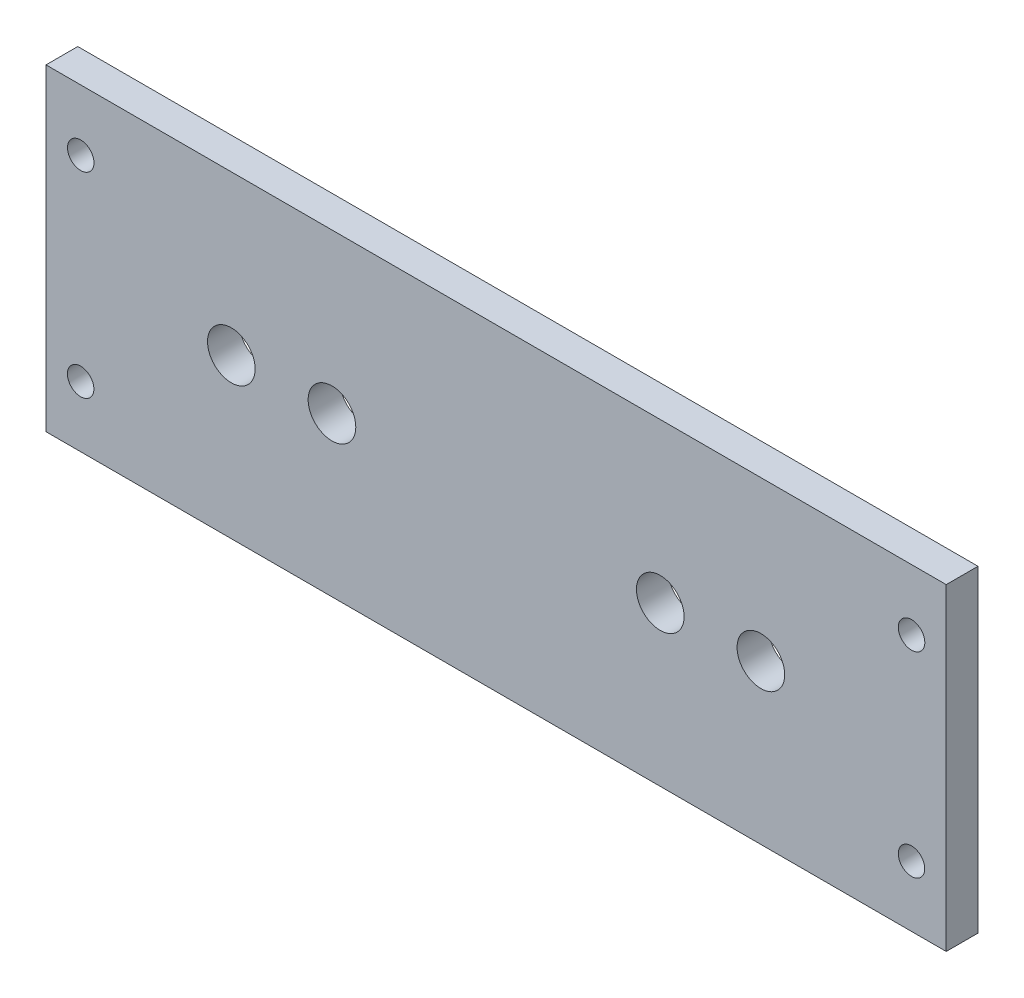
ISO-10303-21;
HEADER;
FILE_DESCRIPTION(('STEP AP214'),'2;1');
FILE_NAME('part.step','',(''),(''),'','','');
FILE_SCHEMA(('AUTOMOTIVE_DESIGN { 1 0 10303 214 1 1 1 1 }'));
ENDSEC;
DATA;
#1=APPLICATION_CONTEXT('core data for automotive mechanical design processes');
#2=APPLICATION_PROTOCOL_DEFINITION('international standard','automotive_design',2000,#1);
#3=PRODUCT_CONTEXT('',#1,'mechanical');
#4=PRODUCT('Part','Part','',(#3));
#5=PRODUCT_RELATED_PRODUCT_CATEGORY('part','',(#4));
#6=PRODUCT_DEFINITION_FORMATION('','',#4);
#7=PRODUCT_DEFINITION_CONTEXT('part definition',#1,'design');
#8=PRODUCT_DEFINITION('design','',#6,#7);
#9=PRODUCT_DEFINITION_SHAPE('','',#8);
#10=(LENGTH_UNIT() NAMED_UNIT(*) SI_UNIT(.MILLI.,.METRE.));
#11=(NAMED_UNIT(*) PLANE_ANGLE_UNIT() SI_UNIT($,.RADIAN.));
#12=(NAMED_UNIT(*) SI_UNIT($,.STERADIAN.) SOLID_ANGLE_UNIT());
#13=UNCERTAINTY_MEASURE_WITH_UNIT(LENGTH_MEASURE(1.E-05),#10,'distance_accuracy_value','');
#14=(GEOMETRIC_REPRESENTATION_CONTEXT(3) GLOBAL_UNCERTAINTY_ASSIGNED_CONTEXT((#13)) GLOBAL_UNIT_ASSIGNED_CONTEXT((#10,
#11,#12)) REPRESENTATION_CONTEXT('',''));
#15=CARTESIAN_POINT('',(0.,0.,0.));
#16=DIRECTION('',(0.,0.,1.));
#17=DIRECTION('',(1.,0.,0.));
#18=AXIS2_PLACEMENT_3D('',#15,#16,#17);
#19=CARTESIAN_POINT('',(84.,-25.,6.));
#20=DIRECTION('',(0.,-1.,0.));
#21=DIRECTION('',(0.,0.,-1.));
#22=AXIS2_PLACEMENT_3D('',#19,#20,#21);
#23=PLANE('',#22);
#24=DIRECTION('',(-1.,0.,0.));
#25=VECTOR('',#24,1.);
#26=CARTESIAN_POINT('',(84.,-25.,0.));
#27=LINE('',#26,#25);
#28=CARTESIAN_POINT('',(84.,-25.,0.));
#29=VERTEX_POINT('',#28);
#30=CARTESIAN_POINT('',(-86.,-25.,0.));
#31=VERTEX_POINT('',#30);
#32=EDGE_CURVE('E102',#29,#31,#27,.T.);
#33=ORIENTED_EDGE('',*,*,#32,.F.);
#34=DIRECTION('',(0.,0.,-1.));
#35=VECTOR('',#34,1.);
#36=CARTESIAN_POINT('',(84.,-25.,6.));
#37=LINE('',#36,#35);
#38=CARTESIAN_POINT('',(84.,-25.,6.));
#39=VERTEX_POINT('',#38);
#40=EDGE_CURVE('E11',#39,#29,#37,.T.);
#41=ORIENTED_EDGE('',*,*,#40,.F.);
#42=DIRECTION('',(-1.,0.,0.));
#43=VECTOR('',#42,1.);
#44=CARTESIAN_POINT('',(84.,-25.,6.));
#45=LINE('',#44,#43);
#46=CARTESIAN_POINT('',(-86.,-25.,6.));
#47=VERTEX_POINT('',#46);
#48=EDGE_CURVE('E95',#39,#47,#45,.T.);
#49=ORIENTED_EDGE('',*,*,#48,.T.);
#50=DIRECTION('',(0.,0.,-1.));
#51=VECTOR('',#50,1.);
#52=CARTESIAN_POINT('',(-86.,-25.,6.));
#53=LINE('',#52,#51);
#54=EDGE_CURVE('E40',#47,#31,#53,.T.);
#55=ORIENTED_EDGE('',*,*,#54,.T.);
#56=EDGE_LOOP('',(#33,#41,#49,#55));
#57=FACE_BOUND('',#56,.T.);
#58=ADVANCED_FACE('F37',(#57),#23,.T.);
#59=CARTESIAN_POINT('',(84.,35.,6.));
#60=DIRECTION('',(1.,0.,0.));
#61=DIRECTION('',(0.,0.,-1.));
#62=AXIS2_PLACEMENT_3D('',#59,#60,#61);
#63=PLANE('',#62);
#64=DIRECTION('',(0.,-1.,0.));
#65=VECTOR('',#64,1.);
#66=CARTESIAN_POINT('',(84.,35.,0.));
#67=LINE('',#66,#65);
#68=CARTESIAN_POINT('',(84.,35.,0.));
#69=VERTEX_POINT('',#68);
#70=EDGE_CURVE('E97',#69,#29,#67,.T.);
#71=ORIENTED_EDGE('',*,*,#70,.F.);
#72=DIRECTION('',(0.,0.,-1.));
#73=VECTOR('',#72,1.);
#74=CARTESIAN_POINT('',(84.,35.,6.));
#75=LINE('',#74,#73);
#76=CARTESIAN_POINT('',(84.,35.,6.));
#77=VERTEX_POINT('',#76);
#78=EDGE_CURVE('E46',#77,#69,#75,.T.);
#79=ORIENTED_EDGE('',*,*,#78,.F.);
#80=DIRECTION('',(0.,-1.,0.));
#81=VECTOR('',#80,1.);
#82=CARTESIAN_POINT('',(84.,35.,6.));
#83=LINE('',#82,#81);
#84=EDGE_CURVE('E92',#77,#39,#83,.T.);
#85=ORIENTED_EDGE('',*,*,#84,.T.);
#86=ORIENTED_EDGE('',*,*,#40,.T.);
#87=EDGE_LOOP('',(#71,#79,#85,#86));
#88=FACE_BOUND('',#87,.T.);
#89=ADVANCED_FACE('F113',(#88),#63,.T.);
#90=CARTESIAN_POINT('',(-86.,35.,6.));
#91=DIRECTION('',(0.,1.,0.));
#92=DIRECTION('',(-1.,0.,0.));
#93=AXIS2_PLACEMENT_3D('',#90,#91,#92);
#94=PLANE('',#93);
#95=DIRECTION('',(1.,0.,0.));
#96=VECTOR('',#95,1.);
#97=CARTESIAN_POINT('',(-86.,35.,0.));
#98=LINE('',#97,#96);
#99=CARTESIAN_POINT('',(-86.,35.,0.));
#100=VERTEX_POINT('',#99);
#101=EDGE_CURVE('E87',#100,#69,#98,.T.);
#102=ORIENTED_EDGE('',*,*,#101,.F.);
#103=DIRECTION('',(0.,0.,-1.));
#104=VECTOR('',#103,1.);
#105=CARTESIAN_POINT('',(-86.,35.,6.));
#106=LINE('',#105,#104);
#107=CARTESIAN_POINT('',(-86.,35.,6.));
#108=VERTEX_POINT('',#107);
#109=EDGE_CURVE('E82',#108,#100,#106,.T.);
#110=ORIENTED_EDGE('',*,*,#109,.F.);
#111=DIRECTION('',(1.,0.,0.));
#112=VECTOR('',#111,1.);
#113=CARTESIAN_POINT('',(-86.,35.,6.));
#114=LINE('',#113,#112);
#115=EDGE_CURVE('E85',#108,#77,#114,.T.);
#116=ORIENTED_EDGE('',*,*,#115,.T.);
#117=ORIENTED_EDGE('',*,*,#78,.T.);
#118=EDGE_LOOP('',(#102,#110,#116,#117));
#119=FACE_BOUND('',#118,.T.);
#120=ADVANCED_FACE('F84',(#119),#94,.T.);
#121=CARTESIAN_POINT('',(-86.,-25.,6.));
#122=DIRECTION('',(-1.,0.,0.));
#123=DIRECTION('',(0.,0.,1.));
#124=AXIS2_PLACEMENT_3D('',#121,#122,#123);
#125=PLANE('',#124);
#126=DIRECTION('',(0.,1.,0.));
#127=VECTOR('',#126,1.);
#128=CARTESIAN_POINT('',(-86.,-25.,0.));
#129=LINE('',#128,#127);
#130=EDGE_CURVE('E105',#31,#100,#129,.T.);
#131=ORIENTED_EDGE('',*,*,#130,.F.);
#132=ORIENTED_EDGE('',*,*,#54,.F.);
#133=DIRECTION('',(0.,1.,0.));
#134=VECTOR('',#133,1.);
#135=CARTESIAN_POINT('',(-86.,-25.,6.));
#136=LINE('',#135,#134);
#137=EDGE_CURVE('E91',#47,#108,#136,.T.);
#138=ORIENTED_EDGE('',*,*,#137,.T.);
#139=ORIENTED_EDGE('',*,*,#109,.T.);
#140=EDGE_LOOP('',(#131,#132,#138,#139));
#141=FACE_BOUND('',#140,.T.);
#142=ADVANCED_FACE('F94',(#141),#125,.T.);
#143=CARTESIAN_POINT('',(0.,0.,6.));
#144=DIRECTION('',(0.,0.,-1.));
#145=DIRECTION('',(-1.,0.,0.));
#146=AXIS2_PLACEMENT_3D('',#143,#144,#145);
#147=PLANE('',#146);
#148=CARTESIAN_POINT('',(77.455,23.4999999999992,6.));
#149=DIRECTION('',(0.,0.,-1.));
#150=DIRECTION('',(-1.,0.,0.));
#151=AXIS2_PLACEMENT_3D('',#148,#149,#150);
#152=CIRCLE('',#151,2.49999999999999);
#153=CARTESIAN_POINT('',(74.955,23.4999999999992,6.));
#154=VERTEX_POINT('',#153);
#155=EDGE_CURVE('E170',#154,#154,#152,.T.);
#156=ORIENTED_EDGE('',*,*,#155,.T.);
#157=EDGE_LOOP('',(#156));
#158=FACE_BOUND('',#157,.T.);
#159=CARTESIAN_POINT('',(77.4449999999996,-13.5000000000008,6.));
#160=DIRECTION('',(0.,0.,-1.));
#161=DIRECTION('',(-1.,0.,0.));
#162=AXIS2_PLACEMENT_3D('',#159,#160,#161);
#163=CIRCLE('',#162,2.49999999999999);
#164=CARTESIAN_POINT('',(74.9449999999996,-13.5000000000008,6.));
#165=VERTEX_POINT('',#164);
#166=EDGE_CURVE('E178',#165,#165,#163,.T.);
#167=ORIENTED_EDGE('',*,*,#166,.T.);
#168=EDGE_LOOP('',(#167));
#169=FACE_BOUND('',#168,.T.);
#170=CARTESIAN_POINT('',(-79.4550000000005,-13.5000000000008,6.));
#171=DIRECTION('',(0.,0.,-1.));
#172=DIRECTION('',(-1.,0.,0.));
#173=AXIS2_PLACEMENT_3D('',#170,#171,#172);
#174=CIRCLE('',#173,2.49999999999999);
#175=CARTESIAN_POINT('',(-81.9550000000005,-13.5000000000008,6.));
#176=VERTEX_POINT('',#175);
#177=EDGE_CURVE('E184',#176,#176,#174,.T.);
#178=ORIENTED_EDGE('',*,*,#177,.T.);
#179=EDGE_LOOP('',(#178));
#180=FACE_BOUND('',#179,.T.);
#181=CARTESIAN_POINT('',(-79.4450000000001,23.4999999999992,6.));
#182=DIRECTION('',(0.,0.,-1.));
#183=DIRECTION('',(-1.,0.,0.));
#184=AXIS2_PLACEMENT_3D('',#181,#182,#183);
#185=CIRCLE('',#184,2.5);
#186=CARTESIAN_POINT('',(-81.9450000000001,23.4999999999992,6.));
#187=VERTEX_POINT('',#186);
#188=EDGE_CURVE('E190',#187,#187,#185,.T.);
#189=ORIENTED_EDGE('',*,*,#188,.T.);
#190=EDGE_LOOP('',(#189));
#191=FACE_BOUND('',#190,.T.);
#192=CARTESIAN_POINT('',(-51.,4.99999999999999,6.));
#193=DIRECTION('',(0.,0.,-1.));
#194=DIRECTION('',(1.,0.,0.));
#195=AXIS2_PLACEMENT_3D('',#192,#193,#194);
#196=CIRCLE('',#195,4.5);
#197=CARTESIAN_POINT('',(-46.5,4.99999999999999,6.));
#198=VERTEX_POINT('',#197);
#199=EDGE_CURVE('E196',#198,#198,#196,.T.);
#200=ORIENTED_EDGE('',*,*,#199,.T.);
#201=EDGE_LOOP('',(#200));
#202=FACE_BOUND('',#201,.T.);
#203=CARTESIAN_POINT('',(-32.,4.99999999999999,6.));
#204=DIRECTION('',(0.,0.,-1.));
#205=DIRECTION('',(1.,0.,0.));
#206=AXIS2_PLACEMENT_3D('',#203,#204,#205);
#207=CIRCLE('',#206,4.5);
#208=CARTESIAN_POINT('',(-27.5,4.99999999999999,6.));
#209=VERTEX_POINT('',#208);
#210=EDGE_CURVE('E202',#209,#209,#207,.T.);
#211=ORIENTED_EDGE('',*,*,#210,.T.);
#212=EDGE_LOOP('',(#211));
#213=FACE_BOUND('',#212,.T.);
#214=CARTESIAN_POINT('',(49.,5.,6.));
#215=DIRECTION('',(0.,0.,-1.));
#216=DIRECTION('',(1.,0.,0.));
#217=AXIS2_PLACEMENT_3D('',#214,#215,#216);
#218=CIRCLE('',#217,4.5);
#219=CARTESIAN_POINT('',(53.5,5.,6.));
#220=VERTEX_POINT('',#219);
#221=EDGE_CURVE('E208',#220,#220,#218,.T.);
#222=ORIENTED_EDGE('',*,*,#221,.T.);
#223=EDGE_LOOP('',(#222));
#224=FACE_BOUND('',#223,.T.);
#225=CARTESIAN_POINT('',(30.,5.,6.));
#226=DIRECTION('',(0.,0.,-1.));
#227=DIRECTION('',(1.,0.,0.));
#228=AXIS2_PLACEMENT_3D('',#225,#226,#227);
#229=CIRCLE('',#228,4.5);
#230=CARTESIAN_POINT('',(34.5,5.,6.));
#231=VERTEX_POINT('',#230);
#232=EDGE_CURVE('E106',#231,#231,#229,.T.);
#233=ORIENTED_EDGE('',*,*,#232,.T.);
#234=EDGE_LOOP('',(#233));
#235=FACE_BOUND('',#234,.T.);
#236=ORIENTED_EDGE('',*,*,#48,.F.);
#237=ORIENTED_EDGE('',*,*,#84,.F.);
#238=ORIENTED_EDGE('',*,*,#115,.F.);
#239=ORIENTED_EDGE('',*,*,#137,.F.);
#240=EDGE_LOOP('',(#236,#237,#238,#239));
#241=FACE_BOUND('',#240,.T.);
#242=ADVANCED_FACE('F90',(#158,#169,#180,#191,#202,#213,#224,#235,#241),#147,.F.);
#243=CARTESIAN_POINT('',(0.,0.,0.));
#244=DIRECTION('',(0.,0.,-1.));
#245=DIRECTION('',(-1.,0.,0.));
#246=AXIS2_PLACEMENT_3D('',#243,#244,#245);
#247=PLANE('',#246);
#248=CARTESIAN_POINT('',(77.455,23.4999999999992,0.));
#249=DIRECTION('',(0.,0.,-1.));
#250=DIRECTION('',(-1.,0.,0.));
#251=AXIS2_PLACEMENT_3D('',#248,#249,#250);
#252=CIRCLE('',#251,2.49999999999999);
#253=CARTESIAN_POINT('',(74.955,23.4999999999992,0.));
#254=VERTEX_POINT('',#253);
#255=EDGE_CURVE('E173',#254,#254,#252,.T.);
#256=ORIENTED_EDGE('',*,*,#255,.F.);
#257=EDGE_LOOP('',(#256));
#258=FACE_BOUND('',#257,.T.);
#259=CARTESIAN_POINT('',(77.4449999999996,-13.5000000000008,0.));
#260=DIRECTION('',(0.,0.,-1.));
#261=DIRECTION('',(-1.,0.,0.));
#262=AXIS2_PLACEMENT_3D('',#259,#260,#261);
#263=CIRCLE('',#262,2.49999999999999);
#264=CARTESIAN_POINT('',(74.9449999999996,-13.5000000000008,0.));
#265=VERTEX_POINT('',#264);
#266=EDGE_CURVE('E175',#265,#265,#263,.T.);
#267=ORIENTED_EDGE('',*,*,#266,.F.);
#268=EDGE_LOOP('',(#267));
#269=FACE_BOUND('',#268,.T.);
#270=CARTESIAN_POINT('',(-79.4550000000005,-13.5000000000008,0.));
#271=DIRECTION('',(0.,0.,-1.));
#272=DIRECTION('',(-1.,0.,0.));
#273=AXIS2_PLACEMENT_3D('',#270,#271,#272);
#274=CIRCLE('',#273,2.49999999999999);
#275=CARTESIAN_POINT('',(-81.9550000000005,-13.5000000000008,0.));
#276=VERTEX_POINT('',#275);
#277=EDGE_CURVE('E181',#276,#276,#274,.T.);
#278=ORIENTED_EDGE('',*,*,#277,.F.);
#279=EDGE_LOOP('',(#278));
#280=FACE_BOUND('',#279,.T.);
#281=CARTESIAN_POINT('',(-79.4450000000001,23.4999999999992,0.));
#282=DIRECTION('',(0.,0.,-1.));
#283=DIRECTION('',(-1.,0.,0.));
#284=AXIS2_PLACEMENT_3D('',#281,#282,#283);
#285=CIRCLE('',#284,2.5);
#286=CARTESIAN_POINT('',(-81.9450000000001,23.4999999999992,0.));
#287=VERTEX_POINT('',#286);
#288=EDGE_CURVE('E187',#287,#287,#285,.T.);
#289=ORIENTED_EDGE('',*,*,#288,.F.);
#290=EDGE_LOOP('',(#289));
#291=FACE_BOUND('',#290,.T.);
#292=CARTESIAN_POINT('',(-51.,4.99999999999999,0.));
#293=DIRECTION('',(0.,0.,-1.));
#294=DIRECTION('',(1.,0.,0.));
#295=AXIS2_PLACEMENT_3D('',#292,#293,#294);
#296=CIRCLE('',#295,4.5);
#297=CARTESIAN_POINT('',(-46.5,4.99999999999999,0.));
#298=VERTEX_POINT('',#297);
#299=EDGE_CURVE('E193',#298,#298,#296,.T.);
#300=ORIENTED_EDGE('',*,*,#299,.F.);
#301=EDGE_LOOP('',(#300));
#302=FACE_BOUND('',#301,.T.);
#303=CARTESIAN_POINT('',(-32.,4.99999999999999,0.));
#304=DIRECTION('',(0.,0.,-1.));
#305=DIRECTION('',(1.,0.,0.));
#306=AXIS2_PLACEMENT_3D('',#303,#304,#305);
#307=CIRCLE('',#306,4.5);
#308=CARTESIAN_POINT('',(-27.5,4.99999999999999,0.));
#309=VERTEX_POINT('',#308);
#310=EDGE_CURVE('E199',#309,#309,#307,.T.);
#311=ORIENTED_EDGE('',*,*,#310,.F.);
#312=EDGE_LOOP('',(#311));
#313=FACE_BOUND('',#312,.T.);
#314=CARTESIAN_POINT('',(49.,5.,0.));
#315=DIRECTION('',(0.,0.,-1.));
#316=DIRECTION('',(1.,0.,0.));
#317=AXIS2_PLACEMENT_3D('',#314,#315,#316);
#318=CIRCLE('',#317,4.5);
#319=CARTESIAN_POINT('',(53.5,5.,0.));
#320=VERTEX_POINT('',#319);
#321=EDGE_CURVE('E205',#320,#320,#318,.T.);
#322=ORIENTED_EDGE('',*,*,#321,.F.);
#323=EDGE_LOOP('',(#322));
#324=FACE_BOUND('',#323,.T.);
#325=CARTESIAN_POINT('',(30.,5.,0.));
#326=DIRECTION('',(0.,0.,-1.));
#327=DIRECTION('',(1.,0.,0.));
#328=AXIS2_PLACEMENT_3D('',#325,#326,#327);
#329=CIRCLE('',#328,4.5);
#330=CARTESIAN_POINT('',(34.5,5.,0.));
#331=VERTEX_POINT('',#330);
#332=EDGE_CURVE('E211',#331,#331,#329,.T.);
#333=ORIENTED_EDGE('',*,*,#332,.F.);
#334=EDGE_LOOP('',(#333));
#335=FACE_BOUND('',#334,.T.);
#336=ORIENTED_EDGE('',*,*,#32,.T.);
#337=ORIENTED_EDGE('',*,*,#130,.T.);
#338=ORIENTED_EDGE('',*,*,#101,.T.);
#339=ORIENTED_EDGE('',*,*,#70,.T.);
#340=EDGE_LOOP('',(#336,#337,#338,#339));
#341=FACE_BOUND('',#340,.T.);
#342=ADVANCED_FACE('F112',(#258,#269,#280,#291,#302,#313,#324,#335,#341),#247,.T.);
#343=CARTESIAN_POINT('',(30.,5.,6.));
#344=DIRECTION('',(0.,0.,-1.));
#345=DIRECTION('',(-1.,0.,0.));
#346=AXIS2_PLACEMENT_3D('',#343,#344,#345);
#347=CYLINDRICAL_SURFACE('',#346,4.5);
#348=ORIENTED_EDGE('',*,*,#232,.F.);
#349=EDGE_LOOP('',(#348));
#350=FACE_BOUND('',#349,.T.);
#351=ORIENTED_EDGE('',*,*,#332,.T.);
#352=EDGE_LOOP('',(#351));
#353=FACE_BOUND('',#352,.T.);
#354=ADVANCED_FACE('F131',(#350,#353),#347,.F.);
#355=CARTESIAN_POINT('',(49.,5.,6.));
#356=DIRECTION('',(0.,0.,-1.));
#357=DIRECTION('',(-1.,0.,0.));
#358=AXIS2_PLACEMENT_3D('',#355,#356,#357);
#359=CYLINDRICAL_SURFACE('',#358,4.5);
#360=ORIENTED_EDGE('',*,*,#221,.F.);
#361=EDGE_LOOP('',(#360));
#362=FACE_BOUND('',#361,.T.);
#363=ORIENTED_EDGE('',*,*,#321,.T.);
#364=EDGE_LOOP('',(#363));
#365=FACE_BOUND('',#364,.T.);
#366=ADVANCED_FACE('F138',(#362,#365),#359,.F.);
#367=CARTESIAN_POINT('',(-32.,4.99999999999999,6.));
#368=DIRECTION('',(0.,0.,-1.));
#369=DIRECTION('',(-1.,0.,0.));
#370=AXIS2_PLACEMENT_3D('',#367,#368,#369);
#371=CYLINDRICAL_SURFACE('',#370,4.5);
#372=ORIENTED_EDGE('',*,*,#210,.F.);
#373=EDGE_LOOP('',(#372));
#374=FACE_BOUND('',#373,.T.);
#375=ORIENTED_EDGE('',*,*,#310,.T.);
#376=EDGE_LOOP('',(#375));
#377=FACE_BOUND('',#376,.T.);
#378=ADVANCED_FACE('F142',(#374,#377),#371,.F.);
#379=CARTESIAN_POINT('',(-51.,4.99999999999999,6.));
#380=DIRECTION('',(0.,0.,-1.));
#381=DIRECTION('',(-1.,0.,0.));
#382=AXIS2_PLACEMENT_3D('',#379,#380,#381);
#383=CYLINDRICAL_SURFACE('',#382,4.5);
#384=ORIENTED_EDGE('',*,*,#199,.F.);
#385=EDGE_LOOP('',(#384));
#386=FACE_BOUND('',#385,.T.);
#387=ORIENTED_EDGE('',*,*,#299,.T.);
#388=EDGE_LOOP('',(#387));
#389=FACE_BOUND('',#388,.T.);
#390=ADVANCED_FACE('F146',(#386,#389),#383,.F.);
#391=CARTESIAN_POINT('',(-79.4450000000001,23.4999999999992,6.));
#392=DIRECTION('',(0.,0.,-1.));
#393=DIRECTION('',(-1.,0.,0.));
#394=AXIS2_PLACEMENT_3D('',#391,#392,#393);
#395=CYLINDRICAL_SURFACE('',#394,2.5);
#396=ORIENTED_EDGE('',*,*,#188,.F.);
#397=EDGE_LOOP('',(#396));
#398=FACE_BOUND('',#397,.T.);
#399=ORIENTED_EDGE('',*,*,#288,.T.);
#400=EDGE_LOOP('',(#399));
#401=FACE_BOUND('',#400,.T.);
#402=ADVANCED_FACE('F150',(#398,#401),#395,.F.);
#403=CARTESIAN_POINT('',(-79.4550000000005,-13.5000000000008,6.));
#404=DIRECTION('',(0.,0.,-1.));
#405=DIRECTION('',(-1.,0.,0.));
#406=AXIS2_PLACEMENT_3D('',#403,#404,#405);
#407=CYLINDRICAL_SURFACE('',#406,2.49999999999999);
#408=ORIENTED_EDGE('',*,*,#177,.F.);
#409=EDGE_LOOP('',(#408));
#410=FACE_BOUND('',#409,.T.);
#411=ORIENTED_EDGE('',*,*,#277,.T.);
#412=EDGE_LOOP('',(#411));
#413=FACE_BOUND('',#412,.T.);
#414=ADVANCED_FACE('F154',(#410,#413),#407,.F.);
#415=CARTESIAN_POINT('',(77.4449999999996,-13.5000000000008,6.));
#416=DIRECTION('',(0.,0.,-1.));
#417=DIRECTION('',(-1.,0.,0.));
#418=AXIS2_PLACEMENT_3D('',#415,#416,#417);
#419=CYLINDRICAL_SURFACE('',#418,2.49999999999999);
#420=ORIENTED_EDGE('',*,*,#166,.F.);
#421=EDGE_LOOP('',(#420));
#422=FACE_BOUND('',#421,.T.);
#423=ORIENTED_EDGE('',*,*,#266,.T.);
#424=EDGE_LOOP('',(#423));
#425=FACE_BOUND('',#424,.T.);
#426=ADVANCED_FACE('F158',(#422,#425),#419,.F.);
#427=CARTESIAN_POINT('',(77.455,23.4999999999992,6.));
#428=DIRECTION('',(0.,0.,-1.));
#429=DIRECTION('',(-1.,0.,0.));
#430=AXIS2_PLACEMENT_3D('',#427,#428,#429);
#431=CYLINDRICAL_SURFACE('',#430,2.49999999999999);
#432=ORIENTED_EDGE('',*,*,#155,.F.);
#433=EDGE_LOOP('',(#432));
#434=FACE_BOUND('',#433,.T.);
#435=ORIENTED_EDGE('',*,*,#255,.T.);
#436=EDGE_LOOP('',(#435));
#437=FACE_BOUND('',#436,.T.);
#438=ADVANCED_FACE('F162',(#434,#437),#431,.F.);
#439=CLOSED_SHELL('',(#58,#89,#120,#142,#242,#342,#354,#366,#378,#390,#402,#414,#426,#438));
#440=MANIFOLD_SOLID_BREP('B2',#439);
#441=ADVANCED_BREP_SHAPE_REPRESENTATION('',(#18,#440),#14);
#442=SHAPE_DEFINITION_REPRESENTATION(#9,#441);
ENDSEC;
END-ISO-10303-21;
